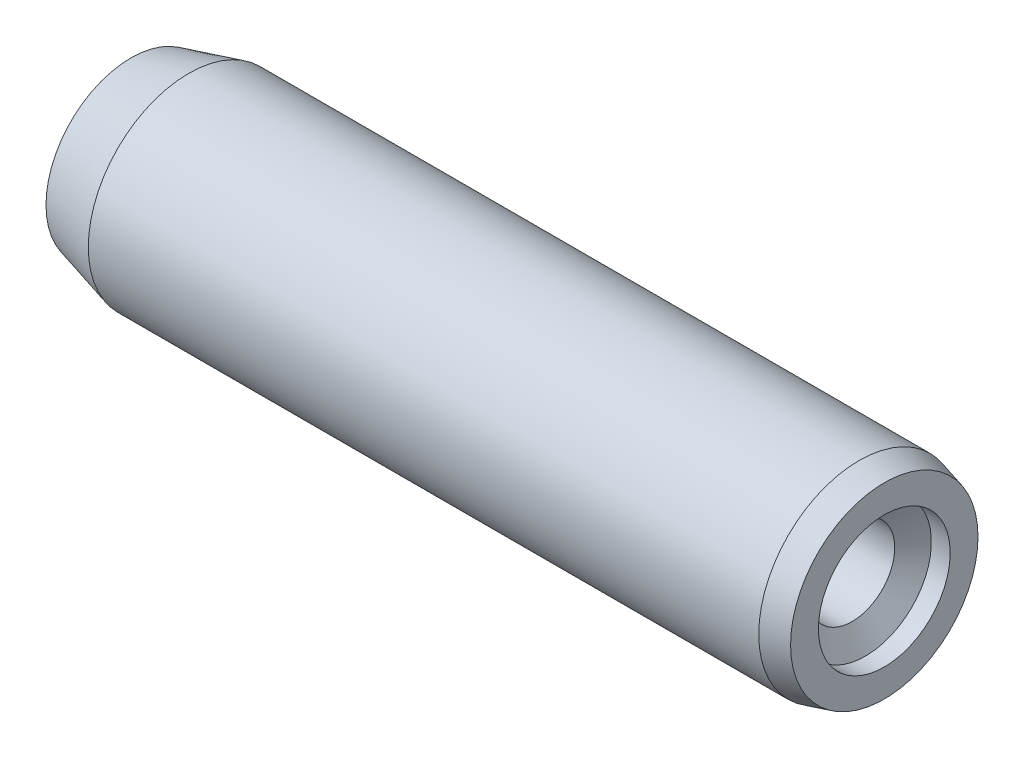
ISO-10303-21;
HEADER;
FILE_DESCRIPTION(('STEP AP214'),'2;1');
FILE_NAME('part.step','',(''),(''),'','','');
FILE_SCHEMA(('AUTOMOTIVE_DESIGN { 1 0 10303 214 1 1 1 1 }'));
ENDSEC;
DATA;
#1=APPLICATION_CONTEXT('core data for automotive mechanical design processes');
#2=APPLICATION_PROTOCOL_DEFINITION('international standard','automotive_design',2000,#1);
#3=PRODUCT_CONTEXT('',#1,'mechanical');
#4=PRODUCT('Part','Part','',(#3));
#5=PRODUCT_RELATED_PRODUCT_CATEGORY('part','',(#4));
#6=PRODUCT_DEFINITION_FORMATION('','',#4);
#7=PRODUCT_DEFINITION_CONTEXT('part definition',#1,'design');
#8=PRODUCT_DEFINITION('design','',#6,#7);
#9=PRODUCT_DEFINITION_SHAPE('','',#8);
#10=(LENGTH_UNIT() NAMED_UNIT(*) SI_UNIT(.MILLI.,.METRE.));
#11=(NAMED_UNIT(*) PLANE_ANGLE_UNIT() SI_UNIT($,.RADIAN.));
#12=(NAMED_UNIT(*) SI_UNIT($,.STERADIAN.) SOLID_ANGLE_UNIT());
#13=UNCERTAINTY_MEASURE_WITH_UNIT(LENGTH_MEASURE(1.E-05),#10,'distance_accuracy_value','');
#14=(GEOMETRIC_REPRESENTATION_CONTEXT(3) GLOBAL_UNCERTAINTY_ASSIGNED_CONTEXT((#13)) GLOBAL_UNIT_ASSIGNED_CONTEXT((#10,
#11,#12)) REPRESENTATION_CONTEXT('',''));
#15=CARTESIAN_POINT('',(0.,0.,0.));
#16=DIRECTION('',(0.,0.,1.));
#17=DIRECTION('',(1.,0.,0.));
#18=AXIS2_PLACEMENT_3D('',#15,#16,#17);
#19=CARTESIAN_POINT('',(60.,7.46410161513776,0.));
#20=DIRECTION('',(-1.,0.,0.));
#21=DIRECTION('',(0.,0.,1.));
#22=AXIS2_PLACEMENT_3D('',#19,#20,#21);
#23=PLANE('',#22);
#24=CARTESIAN_POINT('',(60.,0.,0.));
#25=DIRECTION('',(-1.,0.,0.));
#26=DIRECTION('',(0.,0.,1.));
#27=AXIS2_PLACEMENT_3D('',#24,#25,#26);
#28=CIRCLE('',#27,7.46410161513776);
#29=CARTESIAN_POINT('',(60.,0.,7.46410161513776));
#30=VERTEX_POINT('',#29);
#31=EDGE_CURVE('E70',#30,#30,#28,.T.);
#32=ORIENTED_EDGE('',*,*,#31,.F.);
#33=EDGE_LOOP('',(#32));
#34=FACE_BOUND('',#33,.T.);
#35=CARTESIAN_POINT('',(60.,0.,0.));
#36=DIRECTION('',(-1.,0.,0.));
#37=DIRECTION('',(0.,0.,1.));
#38=AXIS2_PLACEMENT_3D('',#35,#36,#37);
#39=CIRCLE('',#38,5.25);
#40=CARTESIAN_POINT('',(60.,0.,5.25));
#41=VERTEX_POINT('',#40);
#42=EDGE_CURVE('E11',#41,#41,#39,.T.);
#43=ORIENTED_EDGE('',*,*,#42,.T.);
#44=EDGE_LOOP('',(#43));
#45=FACE_BOUND('',#44,.T.);
#46=ADVANCED_FACE('F34',(#34,#45),#23,.F.);
#47=CARTESIAN_POINT('',(0.,0.,0.));
#48=DIRECTION('',(-1.,0.,0.));
#49=DIRECTION('',(0.,0.,1.));
#50=AXIS2_PLACEMENT_3D('',#47,#48,#49);
#51=CYLINDRICAL_SURFACE('',#50,5.25);
#52=ORIENTED_EDGE('',*,*,#42,.F.);
#53=EDGE_LOOP('',(#52));
#54=FACE_BOUND('',#53,.T.);
#55=CARTESIAN_POINT('',(58.5,0.,0.));
#56=DIRECTION('',(-1.,0.,0.));
#57=DIRECTION('',(0.,0.,1.));
#58=AXIS2_PLACEMENT_3D('',#55,#56,#57);
#59=CIRCLE('',#58,5.25);
#60=CARTESIAN_POINT('',(58.5,0.,5.25));
#61=VERTEX_POINT('',#60);
#62=EDGE_CURVE('E40',#61,#61,#59,.T.);
#63=ORIENTED_EDGE('',*,*,#62,.T.);
#64=EDGE_LOOP('',(#63));
#65=FACE_BOUND('',#64,.T.);
#66=ADVANCED_FACE('F61',(#54,#65),#51,.F.);
#67=CARTESIAN_POINT('',(57.4319020019992,0.,0.));
#68=DIRECTION('',(1.,0.,0.));
#69=DIRECTION('',(0.,0.,-1.));
#70=AXIS2_PLACEMENT_3D('',#67,#68,#69);
#71=CONICAL_SURFACE('',#70,3.4,1.0471975511966);
#72=ORIENTED_EDGE('',*,*,#62,.F.);
#73=EDGE_LOOP('',(#72));
#74=FACE_BOUND('',#73,.T.);
#75=CARTESIAN_POINT('',(57.4319020019992,0.,0.));
#76=DIRECTION('',(-1.,0.,0.));
#77=DIRECTION('',(0.,0.,1.));
#78=AXIS2_PLACEMENT_3D('',#75,#76,#77);
#79=CIRCLE('',#78,3.4);
#80=CARTESIAN_POINT('',(57.4319020019992,0.,3.4));
#81=VERTEX_POINT('',#80);
#82=EDGE_CURVE('E76',#81,#81,#79,.T.);
#83=ORIENTED_EDGE('',*,*,#82,.T.);
#84=EDGE_LOOP('',(#83));
#85=FACE_BOUND('',#84,.T.);
#86=ADVANCED_FACE('F56',(#74,#85),#71,.F.);
#87=CARTESIAN_POINT('',(0.,0.,0.));
#88=DIRECTION('',(-1.,0.,0.));
#89=DIRECTION('',(0.,0.,1.));
#90=AXIS2_PLACEMENT_3D('',#87,#88,#89);
#91=CYLINDRICAL_SURFACE('',#90,3.4);
#92=ORIENTED_EDGE('',*,*,#82,.F.);
#93=EDGE_LOOP('',(#92));
#94=FACE_BOUND('',#93,.T.);
#95=CARTESIAN_POINT('',(35.,0.,0.));
#96=DIRECTION('',(-1.,0.,0.));
#97=DIRECTION('',(0.,0.,1.));
#98=AXIS2_PLACEMENT_3D('',#95,#96,#97);
#99=CIRCLE('',#98,3.4);
#100=CARTESIAN_POINT('',(35.,0.,3.4));
#101=VERTEX_POINT('',#100);
#102=EDGE_CURVE('E78',#101,#101,#99,.T.);
#103=ORIENTED_EDGE('',*,*,#102,.T.);
#104=EDGE_LOOP('',(#103));
#105=FACE_BOUND('',#104,.T.);
#106=ADVANCED_FACE('F46',(#94,#105),#91,.F.);
#107=CARTESIAN_POINT('',(33.5916738879315,0.,0.));
#108=DIRECTION('',(1.,0.,0.));
#109=DIRECTION('',(0.,0.,-1.));
#110=AXIS2_PLACEMENT_3D('',#107,#108,#109);
#111=CONICAL_SURFACE('',#110,0.,1.17809724509617);
#112=ORIENTED_EDGE('',*,*,#102,.F.);
#113=EDGE_LOOP('',(#112));
#114=FACE_BOUND('',#113,.T.);
#115=CARTESIAN_POINT('',(33.5916738879315,0.,0.));
#116=VERTEX_POINT('',#115);
#117=VERTEX_LOOP('',#116);
#118=FACE_BOUND('',#117,.T.);
#119=ADVANCED_FACE('F43',(#114,#118),#111,.F.);
#120=CARTESIAN_POINT('',(0.,0.,0.));
#121=DIRECTION('',(1.,0.,0.));
#122=DIRECTION('',(0.,0.,-1.));
#123=AXIS2_PLACEMENT_3D('',#120,#121,#122);
#124=PLANE('',#123);
#125=CARTESIAN_POINT('',(0.,0.,0.));
#126=DIRECTION('',(-1.,0.,0.));
#127=DIRECTION('',(0.,0.,1.));
#128=AXIS2_PLACEMENT_3D('',#125,#126,#127);
#129=CIRCLE('',#128,6.76743371481687);
#130=CARTESIAN_POINT('',(0.,0.,6.76743371481687));
#131=VERTEX_POINT('',#130);
#132=EDGE_CURVE('E83',#131,#131,#129,.T.);
#133=ORIENTED_EDGE('',*,*,#132,.T.);
#134=EDGE_LOOP('',(#133));
#135=FACE_BOUND('',#134,.T.);
#136=ADVANCED_FACE('F45',(#135),#124,.F.);
#137=CARTESIAN_POINT('',(4.6,0.,0.));
#138=DIRECTION('',(1.,0.,0.));
#139=DIRECTION('',(0.,0.,-1.));
#140=AXIS2_PLACEMENT_3D('',#137,#138,#139);
#141=CONICAL_SURFACE('',#140,8.,0.261799387799143);
#142=ORIENTED_EDGE('',*,*,#132,.F.);
#143=EDGE_LOOP('',(#142));
#144=FACE_BOUND('',#143,.T.);
#145=CARTESIAN_POINT('',(4.6,0.,0.));
#146=DIRECTION('',(-1.,0.,0.));
#147=DIRECTION('',(0.,0.,1.));
#148=AXIS2_PLACEMENT_3D('',#145,#146,#147);
#149=CIRCLE('',#148,8.);
#150=CARTESIAN_POINT('',(4.6,0.,8.));
#151=VERTEX_POINT('',#150);
#152=EDGE_CURVE('E86',#151,#151,#149,.T.);
#153=ORIENTED_EDGE('',*,*,#152,.T.);
#154=EDGE_LOOP('',(#153));
#155=FACE_BOUND('',#154,.T.);
#156=ADVANCED_FACE('F53',(#144,#155),#141,.T.);
#157=CARTESIAN_POINT('',(0.,0.,0.));
#158=DIRECTION('',(-1.,0.,0.));
#159=DIRECTION('',(0.,0.,1.));
#160=AXIS2_PLACEMENT_3D('',#157,#158,#159);
#161=CYLINDRICAL_SURFACE('',#160,8.);
#162=ORIENTED_EDGE('',*,*,#152,.F.);
#163=EDGE_LOOP('',(#162));
#164=FACE_BOUND('',#163,.T.);
#165=CARTESIAN_POINT('',(58.,0.,0.));
#166=DIRECTION('',(-1.,0.,0.));
#167=DIRECTION('',(0.,0.,1.));
#168=AXIS2_PLACEMENT_3D('',#165,#166,#167);
#169=CIRCLE('',#168,8.);
#170=CARTESIAN_POINT('',(58.,0.,8.));
#171=VERTEX_POINT('',#170);
#172=EDGE_CURVE('E89',#171,#171,#169,.T.);
#173=ORIENTED_EDGE('',*,*,#172,.T.);
#174=EDGE_LOOP('',(#173));
#175=FACE_BOUND('',#174,.T.);
#176=ADVANCED_FACE('F95',(#164,#175),#161,.T.);
#177=CARTESIAN_POINT('',(60.,0.,0.));
#178=DIRECTION('',(-1.,0.,0.));
#179=DIRECTION('',(0.,0.,1.));
#180=AXIS2_PLACEMENT_3D('',#177,#178,#179);
#181=CONICAL_SURFACE('',#180,7.46410161513776,0.261799387799146);
#182=ORIENTED_EDGE('',*,*,#172,.F.);
#183=EDGE_LOOP('',(#182));
#184=FACE_BOUND('',#183,.T.);
#185=ORIENTED_EDGE('',*,*,#31,.T.);
#186=EDGE_LOOP('',(#185));
#187=FACE_BOUND('',#186,.T.);
#188=ADVANCED_FACE('F93',(#184,#187),#181,.T.);
#189=CLOSED_SHELL('',(#46,#66,#86,#106,#119,#136,#156,#176,#188));
#190=MANIFOLD_SOLID_BREP('B2',#189);
#191=ADVANCED_BREP_SHAPE_REPRESENTATION('',(#18,#190),#14);
#192=SHAPE_DEFINITION_REPRESENTATION(#9,#191);
ENDSEC;
END-ISO-10303-21;
